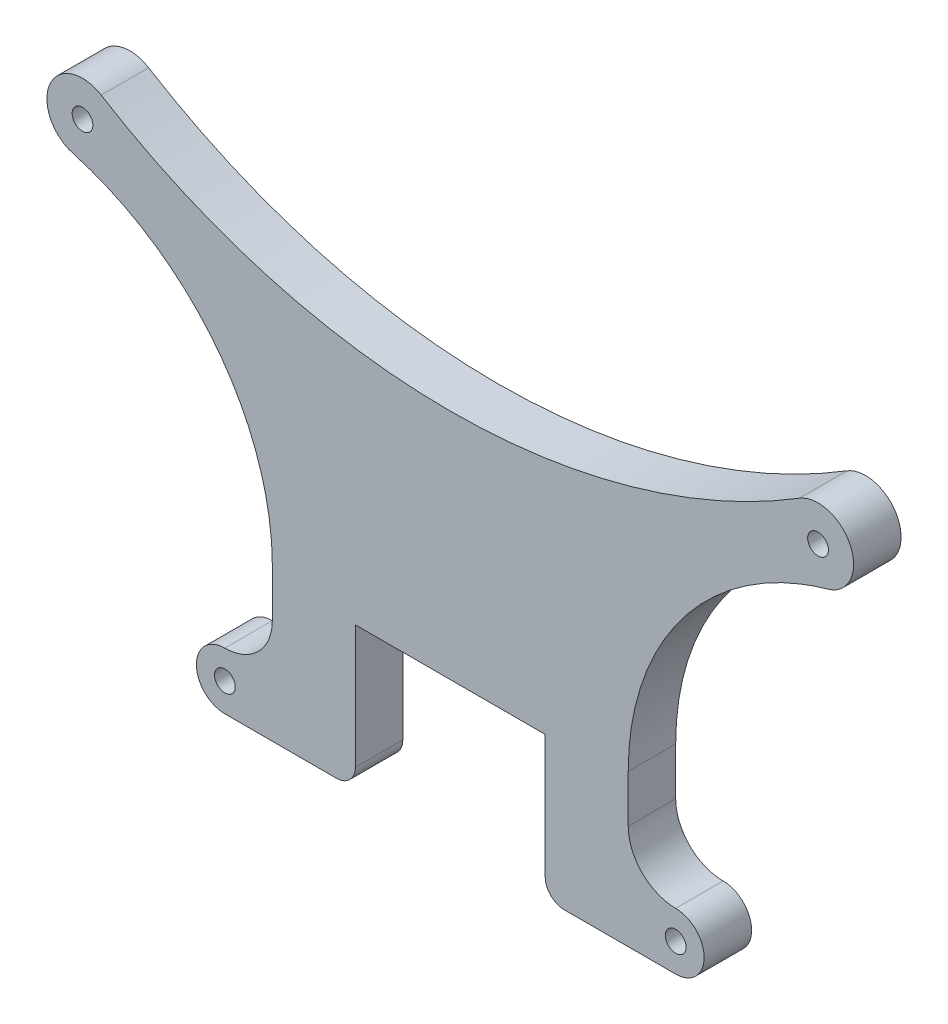
ISO-10303-21;
HEADER;
FILE_DESCRIPTION(('STEP AP214'),'2;1');
FILE_NAME('part.step','',(''),(''),'','','');
FILE_SCHEMA(('AUTOMOTIVE_DESIGN { 1 0 10303 214 1 1 1 1 }'));
ENDSEC;
DATA;
#1=APPLICATION_CONTEXT('core data for automotive mechanical design processes');
#2=APPLICATION_PROTOCOL_DEFINITION('international standard','automotive_design',2000,#1);
#3=PRODUCT_CONTEXT('',#1,'mechanical');
#4=PRODUCT('Part','Part','',(#3));
#5=PRODUCT_RELATED_PRODUCT_CATEGORY('part','',(#4));
#6=PRODUCT_DEFINITION_FORMATION('','',#4);
#7=PRODUCT_DEFINITION_CONTEXT('part definition',#1,'design');
#8=PRODUCT_DEFINITION('design','',#6,#7);
#9=PRODUCT_DEFINITION_SHAPE('','',#8);
#10=(LENGTH_UNIT() NAMED_UNIT(*) SI_UNIT(.MILLI.,.METRE.));
#11=(NAMED_UNIT(*) PLANE_ANGLE_UNIT() SI_UNIT($,.RADIAN.));
#12=(NAMED_UNIT(*) SI_UNIT($,.STERADIAN.) SOLID_ANGLE_UNIT());
#13=UNCERTAINTY_MEASURE_WITH_UNIT(LENGTH_MEASURE(1.E-05),#10,'distance_accuracy_value','');
#14=(GEOMETRIC_REPRESENTATION_CONTEXT(3) GLOBAL_UNCERTAINTY_ASSIGNED_CONTEXT((#13)) GLOBAL_UNIT_ASSIGNED_CONTEXT((#10,
#11,#12)) REPRESENTATION_CONTEXT('',''));
#15=CARTESIAN_POINT('',(0.,0.,0.));
#16=DIRECTION('',(0.,0.,1.));
#17=DIRECTION('',(1.,0.,0.));
#18=AXIS2_PLACEMENT_3D('',#15,#16,#17);
#19=CARTESIAN_POINT('',(-60.8178296691344,1.27,6.35));
#20=DIRECTION('',(0.,0.,-1.));
#21=DIRECTION('',(-1.,0.,0.));
#22=AXIS2_PLACEMENT_3D('',#19,#20,#21);
#23=PLANE('',#22);
#24=CARTESIAN_POINT('',(30.1625,-15.24,6.35));
#25=DIRECTION('',(0.,0.,1.));
#26=DIRECTION('',(-1.,0.,0.));
#27=AXIS2_PLACEMENT_3D('',#24,#25,#26);
#28=CIRCLE('',#27,1.3890625);
#29=CARTESIAN_POINT('',(28.7734375,-15.24,6.35));
#30=VERTEX_POINT('',#29);
#31=EDGE_CURVE('E396',#30,#30,#28,.T.);
#32=ORIENTED_EDGE('',*,*,#31,.F.);
#33=EDGE_LOOP('',(#32));
#34=FACE_BOUND('',#33,.T.);
#35=CARTESIAN_POINT('',(-49.2125,40.3225,6.35));
#36=DIRECTION('',(0.,0.,1.));
#37=DIRECTION('',(1.,0.,0.));
#38=AXIS2_PLACEMENT_3D('',#35,#36,#37);
#39=CIRCLE('',#38,1.3890625);
#40=CARTESIAN_POINT('',(-47.8234375,40.3225,6.35));
#41=VERTEX_POINT('',#40);
#42=EDGE_CURVE('E194',#41,#41,#39,.T.);
#43=ORIENTED_EDGE('',*,*,#42,.F.);
#44=EDGE_LOOP('',(#43));
#45=FACE_BOUND('',#44,.T.);
#46=DIRECTION('',(0.,1.,0.));
#47=VECTOR('',#46,1.);
#48=CARTESIAN_POINT('',(-12.7,0.,6.35));
#49=LINE('',#48,#47);
#50=CARTESIAN_POINT('',(-12.7,-16.51,6.35));
#51=VERTEX_POINT('',#50);
#52=CARTESIAN_POINT('',(-12.7,0.,6.35));
#53=VERTEX_POINT('',#52);
#54=EDGE_CURVE('E225',#51,#53,#49,.T.);
#55=ORIENTED_EDGE('',*,*,#54,.T.);
#56=DIRECTION('',(1.,0.,0.));
#57=VECTOR('',#56,1.);
#58=CARTESIAN_POINT('',(12.7,0.,6.35));
#59=LINE('',#58,#57);
#60=CARTESIAN_POINT('',(12.7,0.,6.35));
#61=VERTEX_POINT('',#60);
#62=EDGE_CURVE('E123',#53,#61,#59,.T.);
#63=ORIENTED_EDGE('',*,*,#62,.T.);
#64=DIRECTION('',(0.,-1.,0.));
#65=VECTOR('',#64,1.);
#66=CARTESIAN_POINT('',(12.7,0.,6.35));
#67=LINE('',#66,#65);
#68=CARTESIAN_POINT('',(12.7,-16.5099999999999,6.35));
#69=VERTEX_POINT('',#68);
#70=EDGE_CURVE('E270',#61,#69,#67,.T.);
#71=ORIENTED_EDGE('',*,*,#70,.T.);
#72=CARTESIAN_POINT('',(15.24,-16.5099999999999,6.35));
#73=DIRECTION('',(0.,0.,1.));
#74=DIRECTION('',(-1.,0.,0.));
#75=AXIS2_PLACEMENT_3D('',#72,#73,#74);
#76=CIRCLE('',#75,2.54);
#77=CARTESIAN_POINT('',(15.24,-19.0499999999999,6.35));
#78=VERTEX_POINT('',#77);
#79=EDGE_CURVE('E289',#69,#78,#76,.T.);
#80=ORIENTED_EDGE('',*,*,#79,.T.);
#81=DIRECTION('',(1.,0.,0.));
#82=VECTOR('',#81,1.);
#83=CARTESIAN_POINT('',(15.24,-19.0499999999999,6.35));
#84=LINE('',#83,#82);
#85=CARTESIAN_POINT('',(30.1625,-19.0499999999999,6.35));
#86=VERTEX_POINT('',#85);
#87=EDGE_CURVE('E286',#78,#86,#84,.T.);
#88=ORIENTED_EDGE('',*,*,#87,.T.);
#89=CARTESIAN_POINT('',(30.1625,-15.24,6.35));
#90=DIRECTION('',(0.,0.,1.));
#91=DIRECTION('',(1.,0.,0.));
#92=AXIS2_PLACEMENT_3D('',#89,#90,#91);
#93=CIRCLE('',#92,3.80999999999999);
#94=CARTESIAN_POINT('',(30.1625,-11.43,6.35));
#95=VERTEX_POINT('',#94);
#96=EDGE_CURVE('E288',#86,#95,#93,.T.);
#97=ORIENTED_EDGE('',*,*,#96,.T.);
#98=CARTESIAN_POINT('',(30.1625,-5.07999999999998,6.35));
#99=DIRECTION('',(0.,0.,-1.));
#100=DIRECTION('',(-1.,0.,0.));
#101=AXIS2_PLACEMENT_3D('',#98,#99,#100);
#102=CIRCLE('',#101,6.35);
#103=CARTESIAN_POINT('',(23.8125,-5.07999999999998,6.35));
#104=VERTEX_POINT('',#103);
#105=EDGE_CURVE('E291',#95,#104,#102,.T.);
#106=ORIENTED_EDGE('',*,*,#105,.T.);
#107=DIRECTION('',(0.,1.,0.));
#108=VECTOR('',#107,1.);
#109=CARTESIAN_POINT('',(23.8125,-5.07999999999998,6.35));
#110=LINE('',#109,#108);
#111=CARTESIAN_POINT('',(23.8125,1.27000000000002,6.35));
#112=VERTEX_POINT('',#111);
#113=EDGE_CURVE('E297',#104,#112,#110,.T.);
#114=ORIENTED_EDGE('',*,*,#113,.T.);
#115=CARTESIAN_POINT('',(60.8178296691344,1.27000000000003,6.35));
#116=DIRECTION('',(0.,0.,-1.));
#117=DIRECTION('',(-1.,0.,0.));
#118=AXIS2_PLACEMENT_3D('',#115,#116,#117);
#119=ELLIPSE('',#118,37.0053296691344,35.8906348104381);
#120=CARTESIAN_POINT('',(50.5029869280307,35.7381734694634,6.35));
#121=VERTEX_POINT('',#120);
#122=EDGE_CURVE('E299',#112,#121,#119,.T.);
#123=ORIENTED_EDGE('',*,*,#122,.T.);
#124=CARTESIAN_POINT('',(49.2125,40.3225,6.35));
#125=DIRECTION('',(0.,0.,1.));
#126=DIRECTION('',(-1.,0.,0.));
#127=AXIS2_PLACEMENT_3D('',#124,#125,#126);
#128=CIRCLE('',#127,4.76250000000001);
#129=CARTESIAN_POINT('',(46.7102658795886,44.3746883787219,6.35));
#130=VERTEX_POINT('',#129);
#131=EDGE_CURVE('E302',#121,#130,#128,.T.);
#132=ORIENTED_EDGE('',*,*,#131,.T.);
#133=CARTESIAN_POINT('',(0.,120.018607954545,6.35));
#134=DIRECTION('',(0.,0.,-1.));
#135=DIRECTION('',(-1.,0.,0.));
#136=AXIS2_PLACEMENT_3D('',#133,#134,#135);
#137=CIRCLE('',#136,88.9036079545454);
#138=CARTESIAN_POINT('',(-46.7102658795886,44.3746883787219,6.35));
#139=VERTEX_POINT('',#138);
#140=EDGE_CURVE('E589',#130,#139,#137,.T.);
#141=ORIENTED_EDGE('',*,*,#140,.T.);
#142=CARTESIAN_POINT('',(-49.2125,40.3225,6.35));
#143=DIRECTION('',(0.,0.,1.));
#144=DIRECTION('',(1.,0.,0.));
#145=AXIS2_PLACEMENT_3D('',#142,#143,#144);
#146=CIRCLE('',#145,4.76250000000002);
#147=CARTESIAN_POINT('',(-50.5029869280307,35.7381734694634,6.35));
#148=VERTEX_POINT('',#147);
#149=EDGE_CURVE('E375',#139,#148,#146,.T.);
#150=ORIENTED_EDGE('',*,*,#149,.T.);
#151=CARTESIAN_POINT('',(-60.8178296691344,1.27,6.35));
#152=DIRECTION('',(0.,0.,-1.));
#153=DIRECTION('',(1.,0.,0.));
#154=AXIS2_PLACEMENT_3D('',#151,#152,#153);
#155=ELLIPSE('',#154,37.0053296691344,35.8906348104381);
#156=CARTESIAN_POINT('',(-23.8125,1.27,6.35));
#157=VERTEX_POINT('',#156);
#158=EDGE_CURVE('E370',#148,#157,#155,.T.);
#159=ORIENTED_EDGE('',*,*,#158,.T.);
#160=DIRECTION('',(0.,-1.,0.));
#161=VECTOR('',#160,1.);
#162=CARTESIAN_POINT('',(-23.8125,-5.08,6.35));
#163=LINE('',#162,#161);
#164=CARTESIAN_POINT('',(-23.8125,-5.08,6.35));
#165=VERTEX_POINT('',#164);
#166=EDGE_CURVE('E374',#157,#165,#163,.T.);
#167=ORIENTED_EDGE('',*,*,#166,.T.);
#168=CARTESIAN_POINT('',(-30.1625,-5.08,6.35));
#169=DIRECTION('',(0.,0.,-1.));
#170=DIRECTION('',(1.,0.,0.));
#171=AXIS2_PLACEMENT_3D('',#168,#169,#170);
#172=CIRCLE('',#171,6.35);
#173=CARTESIAN_POINT('',(-30.1625,-11.43,6.35));
#174=VERTEX_POINT('',#173);
#175=EDGE_CURVE('E172',#165,#174,#172,.T.);
#176=ORIENTED_EDGE('',*,*,#175,.T.);
#177=CARTESIAN_POINT('',(-30.1625,-15.24,6.35));
#178=DIRECTION('',(0.,0.,1.));
#179=DIRECTION('',(-1.,0.,0.));
#180=AXIS2_PLACEMENT_3D('',#177,#178,#179);
#181=CIRCLE('',#180,3.81);
#182=CARTESIAN_POINT('',(-30.1625,-19.05,6.35));
#183=VERTEX_POINT('',#182);
#184=EDGE_CURVE('E166',#174,#183,#181,.T.);
#185=ORIENTED_EDGE('',*,*,#184,.T.);
#186=DIRECTION('',(1.,0.,0.));
#187=VECTOR('',#186,1.);
#188=CARTESIAN_POINT('',(-15.24,-19.05,6.35));
#189=LINE('',#188,#187);
#190=CARTESIAN_POINT('',(-15.24,-19.05,6.35));
#191=VERTEX_POINT('',#190);
#192=EDGE_CURVE('E170',#183,#191,#189,.T.);
#193=ORIENTED_EDGE('',*,*,#192,.T.);
#194=CARTESIAN_POINT('',(-15.24,-16.51,6.35));
#195=DIRECTION('',(0.,0.,1.));
#196=DIRECTION('',(1.,0.,0.));
#197=AXIS2_PLACEMENT_3D('',#194,#195,#196);
#198=CIRCLE('',#197,2.54);
#199=EDGE_CURVE('E50',#191,#51,#198,.T.);
#200=ORIENTED_EDGE('',*,*,#199,.T.);
#201=EDGE_LOOP('',(#55,#63,#71,#80,#88,#97,#106,#114,#123,#132,#141,#150,#159,#167,#176,#185,
#193,#200));
#202=FACE_BOUND('',#201,.T.);
#203=CARTESIAN_POINT('',(-30.1625,-15.24,6.35));
#204=DIRECTION('',(0.,0.,1.));
#205=DIRECTION('',(1.,0.,0.));
#206=AXIS2_PLACEMENT_3D('',#203,#204,#205);
#207=CIRCLE('',#206,1.3890625);
#208=CARTESIAN_POINT('',(-28.7734375,-15.24,6.35));
#209=VERTEX_POINT('',#208);
#210=EDGE_CURVE('E390',#209,#209,#207,.T.);
#211=ORIENTED_EDGE('',*,*,#210,.F.);
#212=EDGE_LOOP('',(#211));
#213=FACE_BOUND('',#212,.T.);
#214=CARTESIAN_POINT('',(49.2125,40.3225,6.35));
#215=DIRECTION('',(0.,0.,1.));
#216=DIRECTION('',(-1.,0.,0.));
#217=AXIS2_PLACEMENT_3D('',#214,#215,#216);
#218=CIRCLE('',#217,1.3890625);
#219=CARTESIAN_POINT('',(47.8234375,40.3225,6.35));
#220=VERTEX_POINT('',#219);
#221=EDGE_CURVE('E402',#220,#220,#218,.T.);
#222=ORIENTED_EDGE('',*,*,#221,.F.);
#223=EDGE_LOOP('',(#222));
#224=FACE_BOUND('',#223,.T.);
#225=ADVANCED_FACE('F33',(#34,#45,#202,#213,#224),#23,.F.);
#226=CARTESIAN_POINT('',(-60.8178296691344,1.27,0.));
#227=DIRECTION('',(0.,0.,-1.));
#228=DIRECTION('',(-1.,0.,0.));
#229=AXIS2_PLACEMENT_3D('',#226,#227,#228);
#230=PLANE('',#229);
#231=CARTESIAN_POINT('',(30.1625,-15.24,0.));
#232=DIRECTION('',(0.,0.,1.));
#233=DIRECTION('',(-1.,0.,0.));
#234=AXIS2_PLACEMENT_3D('',#231,#232,#233);
#235=CIRCLE('',#234,1.3890625);
#236=CARTESIAN_POINT('',(28.7734375,-15.24,0.));
#237=VERTEX_POINT('',#236);
#238=EDGE_CURVE('E399',#237,#237,#235,.T.);
#239=ORIENTED_EDGE('',*,*,#238,.T.);
#240=EDGE_LOOP('',(#239));
#241=FACE_BOUND('',#240,.T.);
#242=CARTESIAN_POINT('',(-49.2125,40.3225,0.));
#243=DIRECTION('',(0.,0.,1.));
#244=DIRECTION('',(1.,0.,0.));
#245=AXIS2_PLACEMENT_3D('',#242,#243,#244);
#246=CIRCLE('',#245,1.3890625);
#247=CARTESIAN_POINT('',(-47.8234375,40.3225,0.));
#248=VERTEX_POINT('',#247);
#249=EDGE_CURVE('E387',#248,#248,#246,.T.);
#250=ORIENTED_EDGE('',*,*,#249,.T.);
#251=EDGE_LOOP('',(#250));
#252=FACE_BOUND('',#251,.T.);
#253=DIRECTION('',(0.,1.,0.));
#254=VECTOR('',#253,1.);
#255=CARTESIAN_POINT('',(-12.7,0.,0.));
#256=LINE('',#255,#254);
#257=CARTESIAN_POINT('',(-12.7,-16.51,0.));
#258=VERTEX_POINT('',#257);
#259=CARTESIAN_POINT('',(-12.7,0.,0.));
#260=VERTEX_POINT('',#259);
#261=EDGE_CURVE('E190',#258,#260,#256,.T.);
#262=ORIENTED_EDGE('',*,*,#261,.F.);
#263=CARTESIAN_POINT('',(-15.24,-16.51,0.));
#264=DIRECTION('',(0.,0.,1.));
#265=DIRECTION('',(1.,0.,0.));
#266=AXIS2_PLACEMENT_3D('',#263,#264,#265);
#267=CIRCLE('',#266,2.54);
#268=CARTESIAN_POINT('',(-15.24,-19.05,0.));
#269=VERTEX_POINT('',#268);
#270=EDGE_CURVE('E115',#269,#258,#267,.T.);
#271=ORIENTED_EDGE('',*,*,#270,.F.);
#272=DIRECTION('',(1.,0.,0.));
#273=VECTOR('',#272,1.);
#274=CARTESIAN_POINT('',(-15.24,-19.05,0.));
#275=LINE('',#274,#273);
#276=CARTESIAN_POINT('',(-30.1625,-19.05,0.));
#277=VERTEX_POINT('',#276);
#278=EDGE_CURVE('E109',#277,#269,#275,.T.);
#279=ORIENTED_EDGE('',*,*,#278,.F.);
#280=CARTESIAN_POINT('',(-30.1625,-15.24,0.));
#281=DIRECTION('',(0.,0.,1.));
#282=DIRECTION('',(-1.,0.,0.));
#283=AXIS2_PLACEMENT_3D('',#280,#281,#282);
#284=CIRCLE('',#283,3.81);
#285=CARTESIAN_POINT('',(-30.1625,-11.43,0.));
#286=VERTEX_POINT('',#285);
#287=EDGE_CURVE('E180',#286,#277,#284,.T.);
#288=ORIENTED_EDGE('',*,*,#287,.F.);
#289=CARTESIAN_POINT('',(-30.1625,-5.08,0.));
#290=DIRECTION('',(0.,0.,-1.));
#291=DIRECTION('',(1.,0.,0.));
#292=AXIS2_PLACEMENT_3D('',#289,#290,#291);
#293=CIRCLE('',#292,6.35);
#294=CARTESIAN_POINT('',(-23.8125,-5.08,0.));
#295=VERTEX_POINT('',#294);
#296=EDGE_CURVE('E220',#295,#286,#293,.T.);
#297=ORIENTED_EDGE('',*,*,#296,.F.);
#298=DIRECTION('',(0.,-1.,0.));
#299=VECTOR('',#298,1.);
#300=CARTESIAN_POINT('',(-23.8125,-5.08,0.));
#301=LINE('',#300,#299);
#302=CARTESIAN_POINT('',(-23.8125,1.27,0.));
#303=VERTEX_POINT('',#302);
#304=EDGE_CURVE('E218',#303,#295,#301,.T.);
#305=ORIENTED_EDGE('',*,*,#304,.F.);
#306=CARTESIAN_POINT('',(-60.8178296691344,1.27,0.));
#307=DIRECTION('',(0.,0.,-1.));
#308=DIRECTION('',(1.,0.,0.));
#309=AXIS2_PLACEMENT_3D('',#306,#307,#308);
#310=ELLIPSE('',#309,37.0053296691344,35.8906348104381);
#311=CARTESIAN_POINT('',(-50.5029869280307,35.7381734694634,0.));
#312=VERTEX_POINT('',#311);
#313=EDGE_CURVE('E216',#312,#303,#310,.T.);
#314=ORIENTED_EDGE('',*,*,#313,.F.);
#315=CARTESIAN_POINT('',(-49.2125,40.3225,0.));
#316=DIRECTION('',(0.,0.,1.));
#317=DIRECTION('',(1.,0.,0.));
#318=AXIS2_PLACEMENT_3D('',#315,#316,#317);
#319=CIRCLE('',#318,4.76250000000002);
#320=CARTESIAN_POINT('',(-46.7102658795886,44.3746883787219,0.));
#321=VERTEX_POINT('',#320);
#322=EDGE_CURVE('E214',#321,#312,#319,.T.);
#323=ORIENTED_EDGE('',*,*,#322,.F.);
#324=CARTESIAN_POINT('',(0.,120.018607954545,0.));
#325=DIRECTION('',(0.,0.,-1.));
#326=DIRECTION('',(-1.,0.,0.));
#327=AXIS2_PLACEMENT_3D('',#324,#325,#326);
#328=CIRCLE('',#327,88.9036079545454);
#329=CARTESIAN_POINT('',(46.7102658795886,44.3746883787219,0.));
#330=VERTEX_POINT('',#329);
#331=EDGE_CURVE('E212',#330,#321,#328,.T.);
#332=ORIENTED_EDGE('',*,*,#331,.F.);
#333=CARTESIAN_POINT('',(49.2125,40.3225,0.));
#334=DIRECTION('',(0.,0.,1.));
#335=DIRECTION('',(-1.,0.,0.));
#336=AXIS2_PLACEMENT_3D('',#333,#334,#335);
#337=CIRCLE('',#336,4.76250000000001);
#338=CARTESIAN_POINT('',(50.5029869280307,35.7381734694634,0.));
#339=VERTEX_POINT('',#338);
#340=EDGE_CURVE('E210',#339,#330,#337,.T.);
#341=ORIENTED_EDGE('',*,*,#340,.F.);
#342=CARTESIAN_POINT('',(60.8178296691344,1.27000000000003,0.));
#343=DIRECTION('',(0.,0.,-1.));
#344=DIRECTION('',(-1.,0.,0.));
#345=AXIS2_PLACEMENT_3D('',#342,#343,#344);
#346=ELLIPSE('',#345,37.0053296691344,35.8906348104381);
#347=CARTESIAN_POINT('',(23.8125,1.27000000000002,0.));
#348=VERTEX_POINT('',#347);
#349=EDGE_CURVE('E208',#348,#339,#346,.T.);
#350=ORIENTED_EDGE('',*,*,#349,.F.);
#351=DIRECTION('',(0.,1.,0.));
#352=VECTOR('',#351,1.);
#353=CARTESIAN_POINT('',(23.8125,-5.07999999999998,0.));
#354=LINE('',#353,#352);
#355=CARTESIAN_POINT('',(23.8125,-5.07999999999998,0.));
#356=VERTEX_POINT('',#355);
#357=EDGE_CURVE('E206',#356,#348,#354,.T.);
#358=ORIENTED_EDGE('',*,*,#357,.F.);
#359=CARTESIAN_POINT('',(30.1625,-5.07999999999998,0.));
#360=DIRECTION('',(0.,0.,-1.));
#361=DIRECTION('',(-1.,0.,0.));
#362=AXIS2_PLACEMENT_3D('',#359,#360,#361);
#363=CIRCLE('',#362,6.35);
#364=CARTESIAN_POINT('',(30.1625,-11.43,0.));
#365=VERTEX_POINT('',#364);
#366=EDGE_CURVE('E204',#365,#356,#363,.T.);
#367=ORIENTED_EDGE('',*,*,#366,.F.);
#368=CARTESIAN_POINT('',(30.1625,-15.24,0.));
#369=DIRECTION('',(0.,0.,1.));
#370=DIRECTION('',(1.,0.,0.));
#371=AXIS2_PLACEMENT_3D('',#368,#369,#370);
#372=CIRCLE('',#371,3.80999999999999);
#373=CARTESIAN_POINT('',(30.1625,-19.0499999999999,0.));
#374=VERTEX_POINT('',#373);
#375=EDGE_CURVE('E202',#374,#365,#372,.T.);
#376=ORIENTED_EDGE('',*,*,#375,.F.);
#377=DIRECTION('',(1.,0.,0.));
#378=VECTOR('',#377,1.);
#379=CARTESIAN_POINT('',(15.24,-19.0499999999999,0.));
#380=LINE('',#379,#378);
#381=CARTESIAN_POINT('',(15.24,-19.0499999999999,0.));
#382=VERTEX_POINT('',#381);
#383=EDGE_CURVE('E200',#382,#374,#380,.T.);
#384=ORIENTED_EDGE('',*,*,#383,.F.);
#385=CARTESIAN_POINT('',(15.24,-16.5099999999999,0.));
#386=DIRECTION('',(0.,0.,1.));
#387=DIRECTION('',(-1.,0.,0.));
#388=AXIS2_PLACEMENT_3D('',#385,#386,#387);
#389=CIRCLE('',#388,2.54);
#390=CARTESIAN_POINT('',(12.7,-16.5099999999999,0.));
#391=VERTEX_POINT('',#390);
#392=EDGE_CURVE('E198',#391,#382,#389,.T.);
#393=ORIENTED_EDGE('',*,*,#392,.F.);
#394=DIRECTION('',(0.,-1.,0.));
#395=VECTOR('',#394,1.);
#396=CARTESIAN_POINT('',(12.7,0.,0.));
#397=LINE('',#396,#395);
#398=CARTESIAN_POINT('',(12.7,0.,0.));
#399=VERTEX_POINT('',#398);
#400=EDGE_CURVE('E196',#399,#391,#397,.T.);
#401=ORIENTED_EDGE('',*,*,#400,.F.);
#402=DIRECTION('',(1.,0.,0.));
#403=VECTOR('',#402,1.);
#404=CARTESIAN_POINT('',(12.7,0.,0.));
#405=LINE('',#404,#403);
#406=EDGE_CURVE('E193',#260,#399,#405,.T.);
#407=ORIENTED_EDGE('',*,*,#406,.F.);
#408=EDGE_LOOP('',(#262,#271,#279,#288,#297,#305,#314,#323,#332,#341,#350,#358,#367,#376,#384,
#393,#401,#407));
#409=FACE_BOUND('',#408,.T.);
#410=CARTESIAN_POINT('',(-30.1625,-15.24,0.));
#411=DIRECTION('',(0.,0.,1.));
#412=DIRECTION('',(1.,0.,0.));
#413=AXIS2_PLACEMENT_3D('',#410,#411,#412);
#414=CIRCLE('',#413,1.3890625);
#415=CARTESIAN_POINT('',(-28.7734375,-15.24,0.));
#416=VERTEX_POINT('',#415);
#417=EDGE_CURVE('E393',#416,#416,#414,.T.);
#418=ORIENTED_EDGE('',*,*,#417,.T.);
#419=EDGE_LOOP('',(#418));
#420=FACE_BOUND('',#419,.T.);
#421=CARTESIAN_POINT('',(49.2125,40.3225,0.));
#422=DIRECTION('',(0.,0.,1.));
#423=DIRECTION('',(-1.,0.,0.));
#424=AXIS2_PLACEMENT_3D('',#421,#422,#423);
#425=CIRCLE('',#424,1.3890625);
#426=CARTESIAN_POINT('',(47.8234375,40.3225,0.));
#427=VERTEX_POINT('',#426);
#428=EDGE_CURVE('E405',#427,#427,#425,.T.);
#429=ORIENTED_EDGE('',*,*,#428,.T.);
#430=EDGE_LOOP('',(#429));
#431=FACE_BOUND('',#430,.T.);
#432=ADVANCED_FACE('F274',(#241,#252,#409,#420,#431),#230,.T.);
#433=CARTESIAN_POINT('',(-12.7,0.,6.35));
#434=DIRECTION('',(-1.,0.,0.));
#435=DIRECTION('',(0.,-1.,0.));
#436=AXIS2_PLACEMENT_3D('',#433,#434,#435);
#437=PLANE('',#436);
#438=ORIENTED_EDGE('',*,*,#261,.T.);
#439=DIRECTION('',(0.,0.,-1.));
#440=VECTOR('',#439,1.);
#441=CARTESIAN_POINT('',(-12.7,0.,6.35));
#442=LINE('',#441,#440);
#443=EDGE_CURVE('E11',#53,#260,#442,.T.);
#444=ORIENTED_EDGE('',*,*,#443,.F.);
#445=ORIENTED_EDGE('',*,*,#54,.F.);
#446=DIRECTION('',(0.,0.,-1.));
#447=VECTOR('',#446,1.);
#448=CARTESIAN_POINT('',(-12.7,-16.51,6.35));
#449=LINE('',#448,#447);
#450=EDGE_CURVE('E186',#51,#258,#449,.T.);
#451=ORIENTED_EDGE('',*,*,#450,.T.);
#452=EDGE_LOOP('',(#438,#444,#445,#451));
#453=FACE_BOUND('',#452,.T.);
#454=ADVANCED_FACE('F35',(#453),#437,.F.);
#455=CARTESIAN_POINT('',(12.7,0.,6.35));
#456=DIRECTION('',(0.,1.,0.));
#457=DIRECTION('',(-1.,0.,0.));
#458=AXIS2_PLACEMENT_3D('',#455,#456,#457);
#459=PLANE('',#458);
#460=ORIENTED_EDGE('',*,*,#406,.T.);
#461=DIRECTION('',(0.,0.,-1.));
#462=VECTOR('',#461,1.);
#463=CARTESIAN_POINT('',(12.7,0.,6.35));
#464=LINE('',#463,#462);
#465=EDGE_CURVE('E42',#61,#399,#464,.T.);
#466=ORIENTED_EDGE('',*,*,#465,.F.);
#467=ORIENTED_EDGE('',*,*,#62,.F.);
#468=ORIENTED_EDGE('',*,*,#443,.T.);
#469=EDGE_LOOP('',(#460,#466,#467,#468));
#470=FACE_BOUND('',#469,.T.);
#471=ADVANCED_FACE('F329',(#470),#459,.F.);
#472=CARTESIAN_POINT('',(12.7,0.,6.35));
#473=DIRECTION('',(1.,0.,0.));
#474=DIRECTION('',(0.,1.,0.));
#475=AXIS2_PLACEMENT_3D('',#472,#473,#474);
#476=PLANE('',#475);
#477=ORIENTED_EDGE('',*,*,#400,.T.);
#478=DIRECTION('',(0.,0.,-1.));
#479=VECTOR('',#478,1.);
#480=CARTESIAN_POINT('',(12.7,-16.5099999999999,6.35));
#481=LINE('',#480,#479);
#482=EDGE_CURVE('E262',#69,#391,#481,.T.);
#483=ORIENTED_EDGE('',*,*,#482,.F.);
#484=ORIENTED_EDGE('',*,*,#70,.F.);
#485=ORIENTED_EDGE('',*,*,#465,.T.);
#486=EDGE_LOOP('',(#477,#483,#484,#485));
#487=FACE_BOUND('',#486,.T.);
#488=ADVANCED_FACE('F268',(#487),#476,.F.);
#489=CARTESIAN_POINT('',(15.24,-16.5099999999999,6.35));
#490=DIRECTION('',(0.,0.,-1.));
#491=DIRECTION('',(-1.,0.,0.));
#492=AXIS2_PLACEMENT_3D('',#489,#490,#491);
#493=CYLINDRICAL_SURFACE('',#492,2.54);
#494=ORIENTED_EDGE('',*,*,#392,.T.);
#495=DIRECTION('',(0.,0.,-1.));
#496=VECTOR('',#495,1.);
#497=CARTESIAN_POINT('',(15.24,-19.0499999999999,6.35));
#498=LINE('',#497,#496);
#499=EDGE_CURVE('E259',#78,#382,#498,.T.);
#500=ORIENTED_EDGE('',*,*,#499,.F.);
#501=ORIENTED_EDGE('',*,*,#79,.F.);
#502=ORIENTED_EDGE('',*,*,#482,.T.);
#503=EDGE_LOOP('',(#494,#500,#501,#502));
#504=FACE_BOUND('',#503,.T.);
#505=ADVANCED_FACE('F280',(#504),#493,.T.);
#506=CARTESIAN_POINT('',(15.24,-19.0499999999999,6.35));
#507=DIRECTION('',(0.,1.,0.));
#508=DIRECTION('',(-1.,0.,0.));
#509=AXIS2_PLACEMENT_3D('',#506,#507,#508);
#510=PLANE('',#509);
#511=ORIENTED_EDGE('',*,*,#383,.T.);
#512=DIRECTION('',(0.,0.,-1.));
#513=VECTOR('',#512,1.);
#514=CARTESIAN_POINT('',(30.1625,-19.0499999999999,6.35));
#515=LINE('',#514,#513);
#516=EDGE_CURVE('E256',#86,#374,#515,.T.);
#517=ORIENTED_EDGE('',*,*,#516,.F.);
#518=ORIENTED_EDGE('',*,*,#87,.F.);
#519=ORIENTED_EDGE('',*,*,#499,.T.);
#520=EDGE_LOOP('',(#511,#517,#518,#519));
#521=FACE_BOUND('',#520,.T.);
#522=ADVANCED_FACE('F284',(#521),#510,.F.);
#523=CARTESIAN_POINT('',(30.1625,-15.24,6.35));
#524=DIRECTION('',(0.,0.,-1.));
#525=DIRECTION('',(-1.,0.,0.));
#526=AXIS2_PLACEMENT_3D('',#523,#524,#525);
#527=CYLINDRICAL_SURFACE('',#526,3.80999999999999);
#528=ORIENTED_EDGE('',*,*,#375,.T.);
#529=DIRECTION('',(0.,0.,-1.));
#530=VECTOR('',#529,1.);
#531=CARTESIAN_POINT('',(30.1625,-11.43,6.35));
#532=LINE('',#531,#530);
#533=EDGE_CURVE('E253',#95,#365,#532,.T.);
#534=ORIENTED_EDGE('',*,*,#533,.F.);
#535=ORIENTED_EDGE('',*,*,#96,.F.);
#536=ORIENTED_EDGE('',*,*,#516,.T.);
#537=EDGE_LOOP('',(#528,#534,#535,#536));
#538=FACE_BOUND('',#537,.T.);
#539=ADVANCED_FACE('F319',(#538),#527,.T.);
#540=CARTESIAN_POINT('',(30.1625,-5.07999999999998,6.35));
#541=DIRECTION('',(0.,0.,-1.));
#542=DIRECTION('',(-1.,0.,0.));
#543=AXIS2_PLACEMENT_3D('',#540,#541,#542);
#544=CYLINDRICAL_SURFACE('',#543,6.35);
#545=ORIENTED_EDGE('',*,*,#366,.T.);
#546=DIRECTION('',(0.,0.,-1.));
#547=VECTOR('',#546,1.);
#548=CARTESIAN_POINT('',(23.8125,-5.07999999999998,6.35));
#549=LINE('',#548,#547);
#550=EDGE_CURVE('E250',#104,#356,#549,.T.);
#551=ORIENTED_EDGE('',*,*,#550,.F.);
#552=ORIENTED_EDGE('',*,*,#105,.F.);
#553=ORIENTED_EDGE('',*,*,#533,.T.);
#554=EDGE_LOOP('',(#545,#551,#552,#553));
#555=FACE_BOUND('',#554,.T.);
#556=ADVANCED_FACE('F315',(#555),#544,.F.);
#557=CARTESIAN_POINT('',(23.8125,-5.07999999999998,6.35));
#558=DIRECTION('',(-1.,0.,0.));
#559=DIRECTION('',(0.,-1.,0.));
#560=AXIS2_PLACEMENT_3D('',#557,#558,#559);
#561=PLANE('',#560);
#562=ORIENTED_EDGE('',*,*,#357,.T.);
#563=DIRECTION('',(0.,0.,-1.));
#564=VECTOR('',#563,1.);
#565=CARTESIAN_POINT('',(23.8125,1.27000000000002,6.35));
#566=LINE('',#565,#564);
#567=EDGE_CURVE('E247',#112,#348,#566,.T.);
#568=ORIENTED_EDGE('',*,*,#567,.F.);
#569=ORIENTED_EDGE('',*,*,#113,.F.);
#570=ORIENTED_EDGE('',*,*,#550,.T.);
#571=EDGE_LOOP('',(#562,#568,#569,#570));
#572=FACE_BOUND('',#571,.T.);
#573=ADVANCED_FACE('F310',(#572),#561,.F.);
#574=DIRECTION('',(0.,0.,-1.));
#575=VECTOR('',#574,1.);
#576=SURFACE_OF_LINEAR_EXTRUSION('',#119,#575);
#577=ORIENTED_EDGE('',*,*,#349,.T.);
#578=DIRECTION('',(0.,0.,-1.));
#579=VECTOR('',#578,1.);
#580=CARTESIAN_POINT('',(50.5029869280307,35.7381734694634,6.35));
#581=LINE('',#580,#579);
#582=EDGE_CURVE('E244',#121,#339,#581,.T.);
#583=ORIENTED_EDGE('',*,*,#582,.F.);
#584=ORIENTED_EDGE('',*,*,#122,.F.);
#585=ORIENTED_EDGE('',*,*,#567,.T.);
#586=EDGE_LOOP('',(#577,#583,#584,#585));
#587=FACE_BOUND('',#586,.T.);
#588=ADVANCED_FACE('F305',(#587),#576,.F.);
#589=CARTESIAN_POINT('',(49.2125,40.3225,6.35));
#590=DIRECTION('',(0.,0.,-1.));
#591=DIRECTION('',(-1.,0.,0.));
#592=AXIS2_PLACEMENT_3D('',#589,#590,#591);
#593=CYLINDRICAL_SURFACE('',#592,4.76250000000001);
#594=ORIENTED_EDGE('',*,*,#340,.T.);
#595=DIRECTION('',(0.,0.,-1.));
#596=VECTOR('',#595,1.);
#597=CARTESIAN_POINT('',(46.7102658795886,44.3746883787219,6.35));
#598=LINE('',#597,#596);
#599=EDGE_CURVE('E241',#130,#330,#598,.T.);
#600=ORIENTED_EDGE('',*,*,#599,.F.);
#601=ORIENTED_EDGE('',*,*,#131,.F.);
#602=ORIENTED_EDGE('',*,*,#582,.T.);
#603=EDGE_LOOP('',(#594,#600,#601,#602));
#604=FACE_BOUND('',#603,.T.);
#605=ADVANCED_FACE('F309',(#604),#593,.T.);
#606=CARTESIAN_POINT('',(0.,120.018607954545,6.35));
#607=DIRECTION('',(0.,0.,-1.));
#608=DIRECTION('',(-1.,0.,0.));
#609=AXIS2_PLACEMENT_3D('',#606,#607,#608);
#610=CYLINDRICAL_SURFACE('',#609,88.9036079545454);
#611=ORIENTED_EDGE('',*,*,#331,.T.);
#612=DIRECTION('',(0.,0.,-1.));
#613=VECTOR('',#612,1.);
#614=CARTESIAN_POINT('',(-46.7102658795886,44.3746883787219,6.35));
#615=LINE('',#614,#613);
#616=EDGE_CURVE('E238',#139,#321,#615,.T.);
#617=ORIENTED_EDGE('',*,*,#616,.F.);
#618=ORIENTED_EDGE('',*,*,#140,.F.);
#619=ORIENTED_EDGE('',*,*,#599,.T.);
#620=EDGE_LOOP('',(#611,#617,#618,#619));
#621=FACE_BOUND('',#620,.T.);
#622=ADVANCED_FACE('F470',(#621),#610,.F.);
#623=CARTESIAN_POINT('',(-49.2125,40.3225,6.35));
#624=DIRECTION('',(0.,0.,-1.));
#625=DIRECTION('',(-1.,0.,0.));
#626=AXIS2_PLACEMENT_3D('',#623,#624,#625);
#627=CYLINDRICAL_SURFACE('',#626,4.76250000000002);
#628=ORIENTED_EDGE('',*,*,#322,.T.);
#629=DIRECTION('',(0.,0.,-1.));
#630=VECTOR('',#629,1.);
#631=CARTESIAN_POINT('',(-50.5029869280307,35.7381734694634,6.35));
#632=LINE('',#631,#630);
#633=EDGE_CURVE('E235',#148,#312,#632,.T.);
#634=ORIENTED_EDGE('',*,*,#633,.F.);
#635=ORIENTED_EDGE('',*,*,#149,.F.);
#636=ORIENTED_EDGE('',*,*,#616,.T.);
#637=EDGE_LOOP('',(#628,#634,#635,#636));
#638=FACE_BOUND('',#637,.T.);
#639=ADVANCED_FACE('F368',(#638),#627,.T.);
#640=DIRECTION('',(0.,0.,-1.));
#641=VECTOR('',#640,1.);
#642=SURFACE_OF_LINEAR_EXTRUSION('',#155,#641);
#643=ORIENTED_EDGE('',*,*,#313,.T.);
#644=DIRECTION('',(0.,0.,-1.));
#645=VECTOR('',#644,1.);
#646=CARTESIAN_POINT('',(-23.8125,1.27,6.35));
#647=LINE('',#646,#645);
#648=EDGE_CURVE('E232',#157,#303,#647,.T.);
#649=ORIENTED_EDGE('',*,*,#648,.F.);
#650=ORIENTED_EDGE('',*,*,#158,.F.);
#651=ORIENTED_EDGE('',*,*,#633,.T.);
#652=EDGE_LOOP('',(#643,#649,#650,#651));
#653=FACE_BOUND('',#652,.T.);
#654=ADVANCED_FACE('F363',(#653),#642,.F.);
#655=CARTESIAN_POINT('',(-23.8125,-5.08,6.35));
#656=DIRECTION('',(1.,0.,0.));
#657=DIRECTION('',(0.,1.,0.));
#658=AXIS2_PLACEMENT_3D('',#655,#656,#657);
#659=PLANE('',#658);
#660=ORIENTED_EDGE('',*,*,#304,.T.);
#661=DIRECTION('',(0.,0.,-1.));
#662=VECTOR('',#661,1.);
#663=CARTESIAN_POINT('',(-23.8125,-5.08,6.35));
#664=LINE('',#663,#662);
#665=EDGE_CURVE('E229',#165,#295,#664,.T.);
#666=ORIENTED_EDGE('',*,*,#665,.F.);
#667=ORIENTED_EDGE('',*,*,#166,.F.);
#668=ORIENTED_EDGE('',*,*,#648,.T.);
#669=EDGE_LOOP('',(#660,#666,#667,#668));
#670=FACE_BOUND('',#669,.T.);
#671=ADVANCED_FACE('F359',(#670),#659,.F.);
#672=CARTESIAN_POINT('',(-30.1625,-5.08,6.35));
#673=DIRECTION('',(0.,0.,-1.));
#674=DIRECTION('',(-1.,0.,0.));
#675=AXIS2_PLACEMENT_3D('',#672,#673,#674);
#676=CYLINDRICAL_SURFACE('',#675,6.35);
#677=ORIENTED_EDGE('',*,*,#296,.T.);
#678=DIRECTION('',(0.,0.,-1.));
#679=VECTOR('',#678,1.);
#680=CARTESIAN_POINT('',(-30.1625,-11.43,6.35));
#681=LINE('',#680,#679);
#682=EDGE_CURVE('E181',#174,#286,#681,.T.);
#683=ORIENTED_EDGE('',*,*,#682,.F.);
#684=ORIENTED_EDGE('',*,*,#175,.F.);
#685=ORIENTED_EDGE('',*,*,#665,.T.);
#686=EDGE_LOOP('',(#677,#683,#684,#685));
#687=FACE_BOUND('',#686,.T.);
#688=ADVANCED_FACE('F356',(#687),#676,.F.);
#689=CARTESIAN_POINT('',(-30.1625,-15.24,6.35));
#690=DIRECTION('',(0.,0.,-1.));
#691=DIRECTION('',(-1.,0.,0.));
#692=AXIS2_PLACEMENT_3D('',#689,#690,#691);
#693=CYLINDRICAL_SURFACE('',#692,3.81);
#694=ORIENTED_EDGE('',*,*,#287,.T.);
#695=DIRECTION('',(0.,0.,-1.));
#696=VECTOR('',#695,1.);
#697=CARTESIAN_POINT('',(-30.1625,-19.05,6.35));
#698=LINE('',#697,#696);
#699=EDGE_CURVE('E177',#183,#277,#698,.T.);
#700=ORIENTED_EDGE('',*,*,#699,.F.);
#701=ORIENTED_EDGE('',*,*,#184,.F.);
#702=ORIENTED_EDGE('',*,*,#682,.T.);
#703=EDGE_LOOP('',(#694,#700,#701,#702));
#704=FACE_BOUND('',#703,.T.);
#705=ADVANCED_FACE('F178',(#704),#693,.T.);
#706=CARTESIAN_POINT('',(-15.24,-19.05,6.35));
#707=DIRECTION('',(0.,1.,0.));
#708=DIRECTION('',(-1.,0.,0.));
#709=AXIS2_PLACEMENT_3D('',#706,#707,#708);
#710=PLANE('',#709);
#711=ORIENTED_EDGE('',*,*,#278,.T.);
#712=DIRECTION('',(0.,0.,-1.));
#713=VECTOR('',#712,1.);
#714=CARTESIAN_POINT('',(-15.24,-19.05,6.35));
#715=LINE('',#714,#713);
#716=EDGE_CURVE('E182',#191,#269,#715,.T.);
#717=ORIENTED_EDGE('',*,*,#716,.F.);
#718=ORIENTED_EDGE('',*,*,#192,.F.);
#719=ORIENTED_EDGE('',*,*,#699,.T.);
#720=EDGE_LOOP('',(#711,#717,#718,#719));
#721=FACE_BOUND('',#720,.T.);
#722=ADVANCED_FACE('F184',(#721),#710,.F.);
#723=CARTESIAN_POINT('',(-15.24,-16.51,6.35));
#724=DIRECTION('',(0.,0.,-1.));
#725=DIRECTION('',(-1.,0.,0.));
#726=AXIS2_PLACEMENT_3D('',#723,#724,#725);
#727=CYLINDRICAL_SURFACE('',#726,2.54);
#728=ORIENTED_EDGE('',*,*,#270,.T.);
#729=ORIENTED_EDGE('',*,*,#450,.F.);
#730=ORIENTED_EDGE('',*,*,#199,.F.);
#731=ORIENTED_EDGE('',*,*,#716,.T.);
#732=EDGE_LOOP('',(#728,#729,#730,#731));
#733=FACE_BOUND('',#732,.T.);
#734=ADVANCED_FACE('F349',(#733),#727,.T.);
#735=CARTESIAN_POINT('',(-49.2125,40.3225,6.35));
#736=DIRECTION('',(0.,0.,-1.));
#737=DIRECTION('',(-1.,0.,0.));
#738=AXIS2_PLACEMENT_3D('',#735,#736,#737);
#739=CYLINDRICAL_SURFACE('',#738,1.3890625);
#740=ORIENTED_EDGE('',*,*,#42,.T.);
#741=EDGE_LOOP('',(#740));
#742=FACE_BOUND('',#741,.T.);
#743=ORIENTED_EDGE('',*,*,#249,.F.);
#744=EDGE_LOOP('',(#743));
#745=FACE_BOUND('',#744,.T.);
#746=ADVANCED_FACE('F346',(#742,#745),#739,.F.);
#747=CARTESIAN_POINT('',(-30.1625,-15.24,6.35));
#748=DIRECTION('',(0.,0.,-1.));
#749=DIRECTION('',(-1.,0.,0.));
#750=AXIS2_PLACEMENT_3D('',#747,#748,#749);
#751=CYLINDRICAL_SURFACE('',#750,1.3890625);
#752=ORIENTED_EDGE('',*,*,#210,.T.);
#753=EDGE_LOOP('',(#752));
#754=FACE_BOUND('',#753,.T.);
#755=ORIENTED_EDGE('',*,*,#417,.F.);
#756=EDGE_LOOP('',(#755));
#757=FACE_BOUND('',#756,.T.);
#758=ADVANCED_FACE('F422',(#754,#757),#751,.F.);
#759=CARTESIAN_POINT('',(30.1625,-15.24,6.35));
#760=DIRECTION('',(0.,0.,-1.));
#761=DIRECTION('',(-1.,0.,0.));
#762=AXIS2_PLACEMENT_3D('',#759,#760,#761);
#763=CYLINDRICAL_SURFACE('',#762,1.3890625);
#764=ORIENTED_EDGE('',*,*,#31,.T.);
#765=EDGE_LOOP('',(#764));
#766=FACE_BOUND('',#765,.T.);
#767=ORIENTED_EDGE('',*,*,#238,.F.);
#768=EDGE_LOOP('',(#767));
#769=FACE_BOUND('',#768,.T.);
#770=ADVANCED_FACE('F415',(#766,#769),#763,.F.);
#771=CARTESIAN_POINT('',(49.2125,40.3225,6.35));
#772=DIRECTION('',(0.,0.,-1.));
#773=DIRECTION('',(-1.,0.,0.));
#774=AXIS2_PLACEMENT_3D('',#771,#772,#773);
#775=CYLINDRICAL_SURFACE('',#774,1.3890625);
#776=ORIENTED_EDGE('',*,*,#221,.T.);
#777=EDGE_LOOP('',(#776));
#778=FACE_BOUND('',#777,.T.);
#779=ORIENTED_EDGE('',*,*,#428,.F.);
#780=EDGE_LOOP('',(#779));
#781=FACE_BOUND('',#780,.T.);
#782=ADVANCED_FACE('F411',(#778,#781),#775,.F.);
#783=CLOSED_SHELL('',(#225,#432,#454,#471,#488,#505,#522,#539,#556,#573,#588,#605,#622,#639,
#654,#671,#688,#705,#722,#734,#746,#758,#770,#782));
#784=MANIFOLD_SOLID_BREP('B2',#783);
#785=ADVANCED_BREP_SHAPE_REPRESENTATION('',(#18,#784),#14);
#786=SHAPE_DEFINITION_REPRESENTATION(#9,#785);
ENDSEC;
END-ISO-10303-21;
